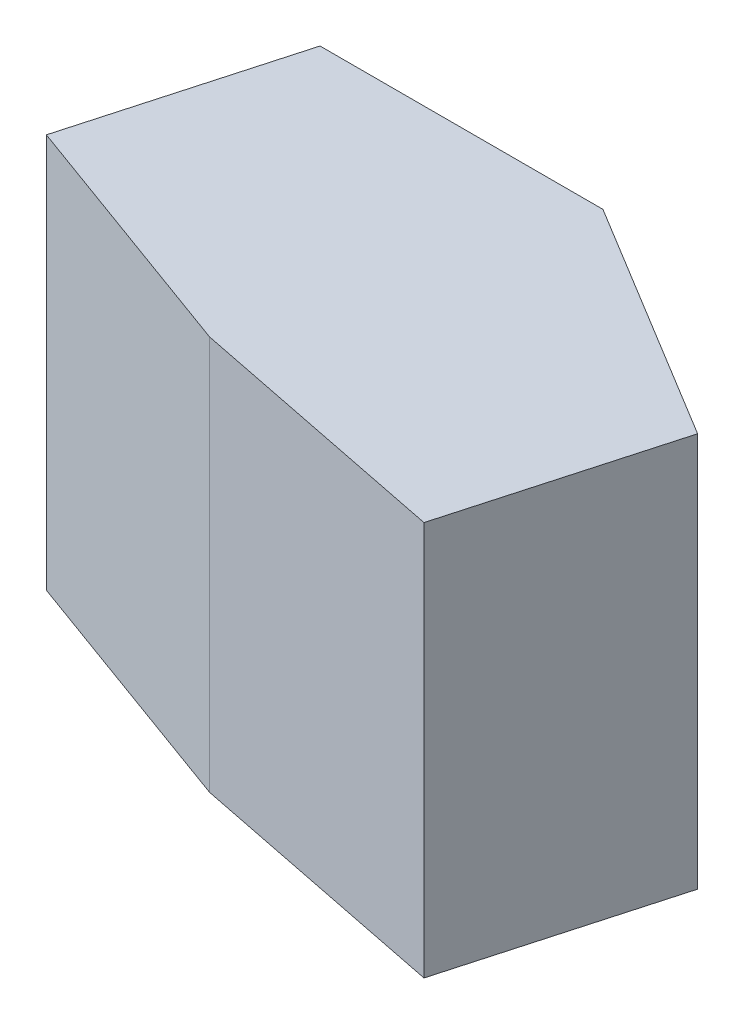
ISO-10303-21;
HEADER;
FILE_DESCRIPTION(('STEP AP214'),'2;1');
FILE_NAME('part.step','',(''),(''),'','','');
FILE_SCHEMA(('AUTOMOTIVE_DESIGN { 1 0 10303 214 1 1 1 1 }'));
ENDSEC;
DATA;
#1=APPLICATION_CONTEXT('core data for automotive mechanical design processes');
#2=APPLICATION_PROTOCOL_DEFINITION('international standard','automotive_design',2000,#1);
#3=PRODUCT_CONTEXT('',#1,'mechanical');
#4=PRODUCT('Part','Part','',(#3));
#5=PRODUCT_RELATED_PRODUCT_CATEGORY('part','',(#4));
#6=PRODUCT_DEFINITION_FORMATION('','',#4);
#7=PRODUCT_DEFINITION_CONTEXT('part definition',#1,'design');
#8=PRODUCT_DEFINITION('design','',#6,#7);
#9=PRODUCT_DEFINITION_SHAPE('','',#8);
#10=(LENGTH_UNIT() NAMED_UNIT(*) SI_UNIT(.MILLI.,.METRE.));
#11=(NAMED_UNIT(*) PLANE_ANGLE_UNIT() SI_UNIT($,.RADIAN.));
#12=(NAMED_UNIT(*) SI_UNIT($,.STERADIAN.) SOLID_ANGLE_UNIT());
#13=UNCERTAINTY_MEASURE_WITH_UNIT(LENGTH_MEASURE(1.E-05),#10,'distance_accuracy_value','');
#14=(GEOMETRIC_REPRESENTATION_CONTEXT(3) GLOBAL_UNCERTAINTY_ASSIGNED_CONTEXT((#13)) GLOBAL_UNIT_ASSIGNED_CONTEXT((#10,
#11,#12)) REPRESENTATION_CONTEXT('',''));
#15=CARTESIAN_POINT('',(0.,0.,0.));
#16=DIRECTION('',(0.,0.,1.));
#17=DIRECTION('',(1.,0.,0.));
#18=AXIS2_PLACEMENT_3D('',#15,#16,#17);
#19=CARTESIAN_POINT('',(19.3571955222303,6.5,7.04544298896284));
#20=DIRECTION('',(0.342020143325669,0.,-0.939692620785908));
#21=DIRECTION('',(-0.939692620785908,0.,-0.342020143325669));
#22=AXIS2_PLACEMENT_3D('',#19,#20,#21);
#23=PLANE('',#22);
#24=DIRECTION('',(0.939692620785908,0.,0.342020143325669));
#25=VECTOR('',#24,1.);
#26=CARTESIAN_POINT('',(19.3571955222303,-6.5,7.04544298896284));
#27=LINE('',#26,#25);
#28=CARTESIAN_POINT('',(19.3571955222303,-6.5,7.04544298896284));
#29=VERTEX_POINT('',#28);
#30=CARTESIAN_POINT('',(27.8183314016147,-6.5,10.1250445971406));
#31=VERTEX_POINT('',#30);
#32=EDGE_CURVE('E134',#29,#31,#27,.T.);
#33=ORIENTED_EDGE('',*,*,#32,.T.);
#34=DIRECTION('',(0.,-1.,0.));
#35=VECTOR('',#34,1.);
#36=CARTESIAN_POINT('',(27.8183314016147,6.5,10.1250445971406));
#37=LINE('',#36,#35);
#38=CARTESIAN_POINT('',(27.8183314016147,6.5,10.1250445971406));
#39=VERTEX_POINT('',#38);
#40=EDGE_CURVE('E131',#39,#31,#37,.T.);
#41=ORIENTED_EDGE('',*,*,#40,.F.);
#42=DIRECTION('',(0.939692620785908,0.,0.342020143325669));
#43=VECTOR('',#42,1.);
#44=CARTESIAN_POINT('',(19.3571955222303,6.5,7.04544298896284));
#45=LINE('',#44,#43);
#46=CARTESIAN_POINT('',(19.3571955222303,6.5,7.04544298896284));
#47=VERTEX_POINT('',#46);
#48=EDGE_CURVE('E79',#47,#39,#45,.T.);
#49=ORIENTED_EDGE('',*,*,#48,.F.);
#50=DIRECTION('',(0.,-1.,0.));
#51=VECTOR('',#50,1.);
#52=CARTESIAN_POINT('',(19.3571955222303,6.5,7.04544298896284));
#53=LINE('',#52,#51);
#54=EDGE_CURVE('E47',#47,#29,#53,.T.);
#55=ORIENTED_EDGE('',*,*,#54,.T.);
#56=EDGE_LOOP('',(#33,#41,#49,#55));
#57=FACE_BOUND('',#56,.T.);
#58=ADVANCED_FACE('F39',(#57),#23,.F.);
#59=CARTESIAN_POINT('',(21.3312998553086,6.5,0.));
#60=DIRECTION('',(0.,0.,1.));
#61=DIRECTION('',(1.,0.,0.));
#62=AXIS2_PLACEMENT_3D('',#59,#60,#61);
#63=PLANE('',#62);
#64=DIRECTION('',(-1.,0.,0.));
#65=VECTOR('',#64,1.);
#66=CARTESIAN_POINT('',(21.3312998553086,-6.5,0.));
#67=LINE('',#66,#65);
#68=CARTESIAN_POINT('',(30.6554387064849,-6.5,0.));
#69=VERTEX_POINT('',#68);
#70=CARTESIAN_POINT('',(21.3312998553086,-6.5,0.));
#71=VERTEX_POINT('',#70);
#72=EDGE_CURVE('E69',#69,#71,#67,.T.);
#73=ORIENTED_EDGE('',*,*,#72,.T.);
#74=DIRECTION('',(0.,-1.,0.));
#75=VECTOR('',#74,1.);
#76=CARTESIAN_POINT('',(21.3312998553086,6.5,0.));
#77=LINE('',#76,#75);
#78=CARTESIAN_POINT('',(21.3312998553086,6.5,0.));
#79=VERTEX_POINT('',#78);
#80=EDGE_CURVE('E11',#79,#71,#77,.T.);
#81=ORIENTED_EDGE('',*,*,#80,.F.);
#82=DIRECTION('',(-1.,0.,0.));
#83=VECTOR('',#82,1.);
#84=CARTESIAN_POINT('',(21.3312998553086,6.5,0.));
#85=LINE('',#84,#83);
#86=CARTESIAN_POINT('',(30.6554387064849,6.5,0.));
#87=VERTEX_POINT('',#86);
#88=EDGE_CURVE('E136',#87,#79,#85,.T.);
#89=ORIENTED_EDGE('',*,*,#88,.F.);
#90=DIRECTION('',(0.,-1.,0.));
#91=VECTOR('',#90,1.);
#92=CARTESIAN_POINT('',(30.6554387064849,6.5,0.));
#93=LINE('',#92,#91);
#94=EDGE_CURVE('E117',#87,#69,#93,.T.);
#95=ORIENTED_EDGE('',*,*,#94,.T.);
#96=EDGE_LOOP('',(#73,#81,#89,#95));
#97=FACE_BOUND('',#96,.T.);
#98=ADVANCED_FACE('F159',(#97),#63,.F.);
#99=CARTESIAN_POINT('',(19.3571955222303,6.5,7.04544298896284));
#100=DIRECTION('',(0.962915022549213,0.,0.269804854198452));
#101=DIRECTION('',(0.269804854198452,0.,-0.962915022549213));
#102=AXIS2_PLACEMENT_3D('',#99,#100,#101);
#103=PLANE('',#102);
#104=DIRECTION('',(-0.269804854198452,0.,0.962915022549213));
#105=VECTOR('',#104,1.);
#106=CARTESIAN_POINT('',(19.3571955222303,-6.5,7.04544298896284));
#107=LINE('',#106,#105);
#108=EDGE_CURVE('E74',#71,#29,#107,.T.);
#109=ORIENTED_EDGE('',*,*,#108,.T.);
#110=ORIENTED_EDGE('',*,*,#54,.F.);
#111=DIRECTION('',(-0.269804854198452,0.,0.962915022549213));
#112=VECTOR('',#111,1.);
#113=CARTESIAN_POINT('',(19.3571955222303,6.5,7.04544298896284));
#114=LINE('',#113,#112);
#115=EDGE_CURVE('E55',#79,#47,#114,.T.);
#116=ORIENTED_EDGE('',*,*,#115,.F.);
#117=ORIENTED_EDGE('',*,*,#80,.T.);
#118=EDGE_LOOP('',(#109,#110,#116,#117));
#119=FACE_BOUND('',#118,.T.);
#120=ADVANCED_FACE('F164',(#119),#103,.F.);
#121=CARTESIAN_POINT('',(0.,6.5,0.));
#122=DIRECTION('',(0.,-1.,0.));
#123=DIRECTION('',(0.,0.,-1.));
#124=AXIS2_PLACEMENT_3D('',#121,#122,#123);
#125=PLANE('',#124);
#126=ORIENTED_EDGE('',*,*,#48,.T.);
#127=DIRECTION('',(-0.980592503235344,0.,-0.196056988140292));
#128=VECTOR('',#127,1.);
#129=CARTESIAN_POINT('',(36.6477360693249,6.5,11.8903716626766));
#130=LINE('',#129,#128);
#131=CARTESIAN_POINT('',(36.6477360693249,6.5,11.8903716626766));
#132=VERTEX_POINT('',#131);
#133=EDGE_CURVE('E104',#132,#39,#130,.T.);
#134=ORIENTED_EDGE('',*,*,#133,.F.);
#135=DIRECTION('',(-0.269824462796859,0.,0.962909528084745));
#136=VECTOR('',#135,1.);
#137=CARTESIAN_POINT('',(36.6477360693249,6.5,11.8903716626766));
#138=LINE('',#137,#136);
#139=CARTESIAN_POINT('',(38.6219838743181,6.5,4.84496887553352));
#140=VERTEX_POINT('',#139);
#141=EDGE_CURVE('E97',#140,#132,#138,.T.);
#142=ORIENTED_EDGE('',*,*,#141,.F.);
#143=DIRECTION('',(0.854400100104493,0.,0.519615693509571));
#144=VECTOR('',#143,1.);
#145=CARTESIAN_POINT('',(38.6219838743181,6.5,4.84496887553352));
#146=LINE('',#145,#144);
#147=EDGE_CURVE('E101',#87,#140,#146,.T.);
#148=ORIENTED_EDGE('',*,*,#147,.F.);
#149=ORIENTED_EDGE('',*,*,#88,.T.);
#150=ORIENTED_EDGE('',*,*,#115,.T.);
#151=EDGE_LOOP('',(#126,#134,#142,#148,#149,#150));
#152=FACE_BOUND('',#151,.T.);
#153=ADVANCED_FACE('F99',(#152),#125,.F.);
#154=CARTESIAN_POINT('',(0.,-6.5,0.));
#155=DIRECTION('',(0.,-1.,0.));
#156=DIRECTION('',(0.,0.,-1.));
#157=AXIS2_PLACEMENT_3D('',#154,#155,#156);
#158=PLANE('',#157);
#159=ORIENTED_EDGE('',*,*,#32,.F.);
#160=ORIENTED_EDGE('',*,*,#108,.F.);
#161=ORIENTED_EDGE('',*,*,#72,.F.);
#162=DIRECTION('',(0.854400100104493,0.,0.519615693509571));
#163=VECTOR('',#162,1.);
#164=CARTESIAN_POINT('',(38.6219838743181,-6.5,4.84496887553352));
#165=LINE('',#164,#163);
#166=CARTESIAN_POINT('',(38.6219838743181,-6.5,4.84496887553352));
#167=VERTEX_POINT('',#166);
#168=EDGE_CURVE('E126',#69,#167,#165,.T.);
#169=ORIENTED_EDGE('',*,*,#168,.T.);
#170=DIRECTION('',(-0.269824462796859,0.,0.962909528084745));
#171=VECTOR('',#170,1.);
#172=CARTESIAN_POINT('',(36.6477360693249,-6.5,11.8903716626766));
#173=LINE('',#172,#171);
#174=CARTESIAN_POINT('',(36.6477360693249,-6.5,11.8903716626766));
#175=VERTEX_POINT('',#174);
#176=EDGE_CURVE('E113',#167,#175,#173,.T.);
#177=ORIENTED_EDGE('',*,*,#176,.T.);
#178=DIRECTION('',(-0.980592503235344,0.,-0.196056988140292));
#179=VECTOR('',#178,1.);
#180=CARTESIAN_POINT('',(36.6477360693249,-6.5,11.8903716626766));
#181=LINE('',#180,#179);
#182=EDGE_CURVE('E123',#175,#31,#181,.T.);
#183=ORIENTED_EDGE('',*,*,#182,.T.);
#184=EDGE_LOOP('',(#159,#160,#161,#169,#177,#183));
#185=FACE_BOUND('',#184,.T.);
#186=ADVANCED_FACE('F144',(#185),#158,.T.);
#187=CARTESIAN_POINT('',(36.6477360693249,6.5,11.8903716626766));
#188=DIRECTION('',(0.196056988140292,0.,-0.980592503235344));
#189=DIRECTION('',(0.980592503235344,0.,0.196056988140292));
#190=AXIS2_PLACEMENT_3D('',#187,#188,#189);
#191=PLANE('',#190);
#192=ORIENTED_EDGE('',*,*,#182,.F.);
#193=DIRECTION('',(0.,-1.,0.));
#194=VECTOR('',#193,1.);
#195=CARTESIAN_POINT('',(36.6477360693249,6.5,11.8903716626766));
#196=LINE('',#195,#194);
#197=EDGE_CURVE('E108',#132,#175,#196,.T.);
#198=ORIENTED_EDGE('',*,*,#197,.F.);
#199=ORIENTED_EDGE('',*,*,#133,.T.);
#200=ORIENTED_EDGE('',*,*,#40,.T.);
#201=EDGE_LOOP('',(#192,#198,#199,#200));
#202=FACE_BOUND('',#201,.T.);
#203=ADVANCED_FACE('F147',(#202),#191,.F.);
#204=CARTESIAN_POINT('',(38.6219838743181,6.5,4.84496887553352));
#205=DIRECTION('',(-0.519615693509571,0.,0.854400100104493));
#206=DIRECTION('',(-0.854400100104493,0.,-0.519615693509571));
#207=AXIS2_PLACEMENT_3D('',#204,#205,#206);
#208=PLANE('',#207);
#209=ORIENTED_EDGE('',*,*,#168,.F.);
#210=ORIENTED_EDGE('',*,*,#94,.F.);
#211=ORIENTED_EDGE('',*,*,#147,.T.);
#212=DIRECTION('',(0.,-1.,0.));
#213=VECTOR('',#212,1.);
#214=CARTESIAN_POINT('',(38.6219838743181,6.5,4.84496887553352));
#215=LINE('',#214,#213);
#216=EDGE_CURVE('E111',#140,#167,#215,.T.);
#217=ORIENTED_EDGE('',*,*,#216,.T.);
#218=EDGE_LOOP('',(#209,#210,#211,#217));
#219=FACE_BOUND('',#218,.T.);
#220=ADVANCED_FACE('F119',(#219),#208,.F.);
#221=CARTESIAN_POINT('',(36.6477360693249,6.5,11.8903716626766));
#222=DIRECTION('',(-0.962909528084745,0.,-0.269824462796859));
#223=DIRECTION('',(0.269824462796859,0.,-0.962909528084745));
#224=AXIS2_PLACEMENT_3D('',#221,#222,#223);
#225=PLANE('',#224);
#226=ORIENTED_EDGE('',*,*,#176,.F.);
#227=ORIENTED_EDGE('',*,*,#216,.F.);
#228=ORIENTED_EDGE('',*,*,#141,.T.);
#229=ORIENTED_EDGE('',*,*,#197,.T.);
#230=EDGE_LOOP('',(#226,#227,#228,#229));
#231=FACE_BOUND('',#230,.T.);
#232=ADVANCED_FACE('F112',(#231),#225,.F.);
#233=CLOSED_SHELL('',(#58,#98,#120,#153,#186,#203,#220,#232));
#234=MANIFOLD_SOLID_BREP('B2',#233);
#235=ADVANCED_BREP_SHAPE_REPRESENTATION('',(#18,#234),#14);
#236=SHAPE_DEFINITION_REPRESENTATION(#9,#235);
ENDSEC;
END-ISO-10303-21;
